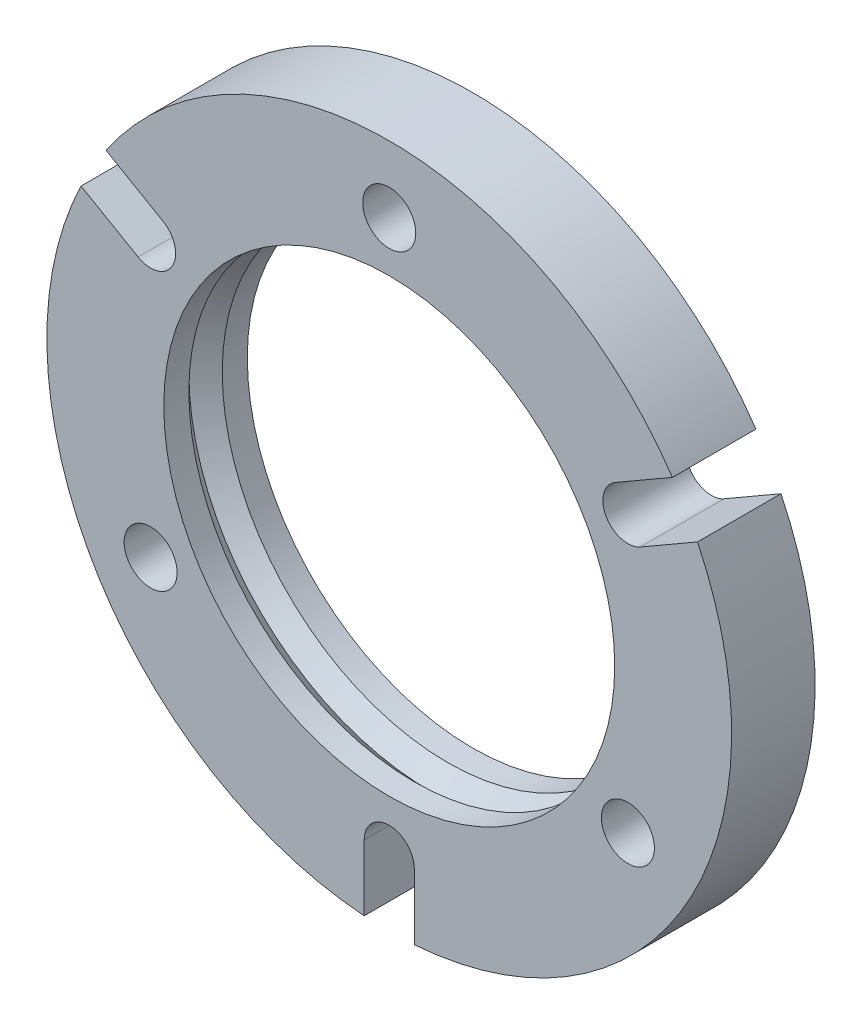
ISO-10303-21;
HEADER;
FILE_DESCRIPTION(('STEP AP214'),'2;1');
FILE_NAME('part.step','',(''),(''),'','','');
FILE_SCHEMA(('AUTOMOTIVE_DESIGN { 1 0 10303 214 1 1 1 1 }'));
ENDSEC;
DATA;
#1=APPLICATION_CONTEXT('core data for automotive mechanical design processes');
#2=APPLICATION_PROTOCOL_DEFINITION('international standard','automotive_design',2000,#1);
#3=PRODUCT_CONTEXT('',#1,'mechanical');
#4=PRODUCT('Part','Part','',(#3));
#5=PRODUCT_RELATED_PRODUCT_CATEGORY('part','',(#4));
#6=PRODUCT_DEFINITION_FORMATION('','',#4);
#7=PRODUCT_DEFINITION_CONTEXT('part definition',#1,'design');
#8=PRODUCT_DEFINITION('design','',#6,#7);
#9=PRODUCT_DEFINITION_SHAPE('','',#8);
#10=(LENGTH_UNIT() NAMED_UNIT(*) SI_UNIT(.MILLI.,.METRE.));
#11=(NAMED_UNIT(*) PLANE_ANGLE_UNIT() SI_UNIT($,.RADIAN.));
#12=(NAMED_UNIT(*) SI_UNIT($,.STERADIAN.) SOLID_ANGLE_UNIT());
#13=UNCERTAINTY_MEASURE_WITH_UNIT(LENGTH_MEASURE(1.E-05),#10,'distance_accuracy_value','');
#14=(GEOMETRIC_REPRESENTATION_CONTEXT(3) GLOBAL_UNCERTAINTY_ASSIGNED_CONTEXT((#13)) GLOBAL_UNIT_ASSIGNED_CONTEXT((#10,
#11,#12)) REPRESENTATION_CONTEXT('',''));
#15=CARTESIAN_POINT('',(0.,0.,0.));
#16=DIRECTION('',(0.,0.,1.));
#17=DIRECTION('',(1.,0.,0.));
#18=AXIS2_PLACEMENT_3D('',#15,#16,#17);
#19=CARTESIAN_POINT('',(0.,0.,5.));
#20=DIRECTION('',(0.,0.,1.));
#21=DIRECTION('',(1.,0.,0.));
#22=AXIS2_PLACEMENT_3D('',#19,#20,#21);
#23=PLANE('',#22);
#24=CARTESIAN_POINT('',(-14.2894191624432,-8.25,5.));
#25=DIRECTION('',(0.,0.,1.));
#26=DIRECTION('',(1.,0.,0.));
#27=AXIS2_PLACEMENT_3D('',#24,#25,#26);
#28=CIRCLE('',#27,1.5875);
#29=CARTESIAN_POINT('',(-12.7019191624432,-8.25,5.));
#30=VERTEX_POINT('',#29);
#31=EDGE_CURVE('E223',#30,#30,#28,.T.);
#32=ORIENTED_EDGE('',*,*,#31,.F.);
#33=EDGE_LOOP('',(#32));
#34=FACE_BOUND('',#33,.T.);
#35=CARTESIAN_POINT('',(0.,16.5,5.));
#36=DIRECTION('',(0.,0.,1.));
#37=DIRECTION('',(1.,0.,0.));
#38=AXIS2_PLACEMENT_3D('',#35,#36,#37);
#39=CIRCLE('',#38,1.5875);
#40=CARTESIAN_POINT('',(1.5875,16.5,5.));
#41=VERTEX_POINT('',#40);
#42=EDGE_CURVE('E235',#41,#41,#39,.T.);
#43=ORIENTED_EDGE('',*,*,#42,.F.);
#44=EDGE_LOOP('',(#43));
#45=FACE_BOUND('',#44,.T.);
#46=CARTESIAN_POINT('',(0.,0.,5.));
#47=DIRECTION('',(0.,0.,1.));
#48=DIRECTION('',(1.,0.,0.));
#49=AXIS2_PLACEMENT_3D('',#46,#47,#48);
#50=CIRCLE('',#49,13.5);
#51=CARTESIAN_POINT('',(13.5,0.,5.));
#52=VERTEX_POINT('',#51);
#53=EDGE_CURVE('E241',#52,#52,#50,.T.);
#54=ORIENTED_EDGE('',*,*,#53,.F.);
#55=EDGE_LOOP('',(#54));
#56=FACE_BOUND('',#55,.T.);
#57=CARTESIAN_POINT('',(14.2894191624432,-8.25,5.));
#58=DIRECTION('',(0.,0.,1.));
#59=DIRECTION('',(1.,0.,0.));
#60=AXIS2_PLACEMENT_3D('',#57,#58,#59);
#61=CIRCLE('',#60,1.5875);
#62=CARTESIAN_POINT('',(15.8769191624432,-8.25,5.));
#63=VERTEX_POINT('',#62);
#64=EDGE_CURVE('E229',#63,#63,#61,.T.);
#65=ORIENTED_EDGE('',*,*,#64,.F.);
#66=EDGE_LOOP('',(#65));
#67=FACE_BOUND('',#66,.T.);
#68=CARTESIAN_POINT('',(14.2894191624433,8.24999999999987,5.));
#69=DIRECTION('',(0.,0.,1.));
#70=DIRECTION('',(-0.499999999999992,0.866025403784443,0.));
#71=AXIS2_PLACEMENT_3D('',#68,#69,#70);
#72=CIRCLE('',#71,1.5);
#73=CARTESIAN_POINT('',(13.5394191624433,9.54903810567653,5.));
#74=VERTEX_POINT('',#73);
#75=CARTESIAN_POINT('',(15.0394191624433,6.9509618943232,5.));
#76=VERTEX_POINT('',#75);
#77=EDGE_CURVE('E152',#74,#76,#72,.T.);
#78=ORIENTED_EDGE('',*,*,#77,.F.);
#79=DIRECTION('',(0.866025403784443,0.499999999999992,0.));
#80=VECTOR('',#79,1.);
#81=CARTESIAN_POINT('',(38.4302201978176,23.919748783795,5.));
#82=LINE('',#81,#80);
#83=CARTESIAN_POINT('',(16.9559312096259,11.5215622558069,5.));
#84=VERTEX_POINT('',#83);
#85=EDGE_CURVE('E133',#74,#84,#82,.T.);
#86=ORIENTED_EDGE('',*,*,#85,.T.);
#87=CARTESIAN_POINT('',(0.,0.,5.));
#88=DIRECTION('',(0.,0.,1.));
#89=DIRECTION('',(1.,0.,0.));
#90=AXIS2_PLACEMENT_3D('',#87,#88,#89);
#91=CIRCLE('',#90,20.5);
#92=CARTESIAN_POINT('',(-16.9559312096257,11.5215622558072,5.));
#93=VERTEX_POINT('',#92);
#94=EDGE_CURVE('E45',#84,#93,#91,.T.);
#95=ORIENTED_EDGE('',*,*,#94,.T.);
#96=DIRECTION('',(-0.866025403784436,0.500000000000004,0.));
#97=VECTOR('',#96,1.);
#98=CARTESIAN_POINT('',(-38.4302201978172,23.9197487837955,5.));
#99=LINE('',#98,#97);
#100=CARTESIAN_POINT('',(-13.5394191624432,9.54903810567672,5.));
#101=VERTEX_POINT('',#100);
#102=EDGE_CURVE('E167',#101,#93,#99,.T.);
#103=ORIENTED_EDGE('',*,*,#102,.F.);
#104=CARTESIAN_POINT('',(-14.2894191624432,8.25000000000007,5.));
#105=DIRECTION('',(0.,0.,1.));
#106=DIRECTION('',(-0.500000000000004,-0.866025403784436,0.));
#107=AXIS2_PLACEMENT_3D('',#104,#105,#106);
#108=CIRCLE('',#107,1.5);
#109=CARTESIAN_POINT('',(-15.0394191624432,6.95096189432341,5.));
#110=VERTEX_POINT('',#109);
#111=EDGE_CURVE('E175',#110,#101,#108,.T.);
#112=ORIENTED_EDGE('',*,*,#111,.F.);
#113=DIRECTION('',(-0.866025403784436,0.500000000000004,0.));
#114=VECTOR('',#113,1.);
#115=CARTESIAN_POINT('',(-39.9302201978172,21.3216725724422,5.));
#116=LINE('',#115,#114);
#117=CARTESIAN_POINT('',(-18.4559312096257,8.92348604445386,5.));
#118=VERTEX_POINT('',#117);
#119=EDGE_CURVE('E160',#110,#118,#116,.T.);
#120=ORIENTED_EDGE('',*,*,#119,.T.);
#121=CARTESIAN_POINT('',(-1.5,-20.4450483002609,5.));
#122=VERTEX_POINT('',#121);
#123=EDGE_CURVE('E46',#118,#122,#91,.T.);
#124=ORIENTED_EDGE('',*,*,#123,.T.);
#125=DIRECTION('',(0.,-1.,0.));
#126=VECTOR('',#125,1.);
#127=CARTESIAN_POINT('',(-1.5,-45.2414213562373,5.));
#128=LINE('',#127,#126);
#129=CARTESIAN_POINT('',(-1.5,-16.5,5.));
#130=VERTEX_POINT('',#129);
#131=EDGE_CURVE('E200',#130,#122,#128,.T.);
#132=ORIENTED_EDGE('',*,*,#131,.F.);
#133=CARTESIAN_POINT('',(0.,-16.5,5.));
#134=DIRECTION('',(0.,0.,1.));
#135=DIRECTION('',(1.,0.,0.));
#136=AXIS2_PLACEMENT_3D('',#133,#134,#135);
#137=CIRCLE('',#136,1.5);
#138=CARTESIAN_POINT('',(1.5,-16.5,5.));
#139=VERTEX_POINT('',#138);
#140=EDGE_CURVE('E209',#139,#130,#137,.T.);
#141=ORIENTED_EDGE('',*,*,#140,.F.);
#142=DIRECTION('',(0.,-1.,0.));
#143=VECTOR('',#142,1.);
#144=CARTESIAN_POINT('',(1.5,-45.2414213562373,5.));
#145=LINE('',#144,#143);
#146=CARTESIAN_POINT('',(1.5,-20.4450483002609,5.));
#147=VERTEX_POINT('',#146);
#148=EDGE_CURVE('E196',#139,#147,#145,.T.);
#149=ORIENTED_EDGE('',*,*,#148,.T.);
#150=CARTESIAN_POINT('',(18.4559312096259,8.92348604445361,5.));
#151=VERTEX_POINT('',#150);
#152=EDGE_CURVE('E11',#147,#151,#91,.T.);
#153=ORIENTED_EDGE('',*,*,#152,.T.);
#154=DIRECTION('',(0.866025403784443,0.499999999999992,0.));
#155=VECTOR('',#154,1.);
#156=CARTESIAN_POINT('',(39.9302201978175,21.3216725724416,5.));
#157=LINE('',#156,#155);
#158=EDGE_CURVE('E53',#76,#151,#157,.T.);
#159=ORIENTED_EDGE('',*,*,#158,.F.);
#160=EDGE_LOOP('',(#78,#86,#95,#103,#112,#120,#124,#132,#141,#149,#153,#159));
#161=FACE_BOUND('',#160,.T.);
#162=ADVANCED_FACE('F36',(#34,#45,#56,#67,#161),#23,.T.);
#163=CARTESIAN_POINT('',(0.,0.,0.));
#164=DIRECTION('',(0.,0.,1.));
#165=DIRECTION('',(1.,0.,0.));
#166=AXIS2_PLACEMENT_3D('',#163,#164,#165);
#167=PLANE('',#166);
#168=CARTESIAN_POINT('',(-14.2894191624432,-8.25,0.));
#169=DIRECTION('',(0.,0.,1.));
#170=DIRECTION('',(1.,0.,0.));
#171=AXIS2_PLACEMENT_3D('',#168,#169,#170);
#172=CIRCLE('',#171,1.5875);
#173=CARTESIAN_POINT('',(-12.7019191624432,-8.25,0.));
#174=VERTEX_POINT('',#173);
#175=EDGE_CURVE('E216',#174,#174,#172,.T.);
#176=ORIENTED_EDGE('',*,*,#175,.T.);
#177=EDGE_LOOP('',(#176));
#178=FACE_BOUND('',#177,.T.);
#179=CARTESIAN_POINT('',(0.,16.5,0.));
#180=DIRECTION('',(0.,0.,1.));
#181=DIRECTION('',(1.,0.,0.));
#182=AXIS2_PLACEMENT_3D('',#179,#180,#181);
#183=CIRCLE('',#182,1.5875);
#184=CARTESIAN_POINT('',(1.5875,16.5,0.));
#185=VERTEX_POINT('',#184);
#186=EDGE_CURVE('E232',#185,#185,#183,.T.);
#187=ORIENTED_EDGE('',*,*,#186,.T.);
#188=EDGE_LOOP('',(#187));
#189=FACE_BOUND('',#188,.T.);
#190=CARTESIAN_POINT('',(0.,0.,0.));
#191=DIRECTION('',(0.,0.,1.));
#192=DIRECTION('',(1.,0.,0.));
#193=AXIS2_PLACEMENT_3D('',#190,#191,#192);
#194=CIRCLE('',#193,13.5);
#195=CARTESIAN_POINT('',(13.5,0.,0.));
#196=VERTEX_POINT('',#195);
#197=EDGE_CURVE('E238',#196,#196,#194,.T.);
#198=ORIENTED_EDGE('',*,*,#197,.T.);
#199=EDGE_LOOP('',(#198));
#200=FACE_BOUND('',#199,.T.);
#201=CARTESIAN_POINT('',(14.2894191624432,-8.25,0.));
#202=DIRECTION('',(0.,0.,1.));
#203=DIRECTION('',(1.,0.,0.));
#204=AXIS2_PLACEMENT_3D('',#201,#202,#203);
#205=CIRCLE('',#204,1.5875);
#206=CARTESIAN_POINT('',(15.8769191624432,-8.25,0.));
#207=VERTEX_POINT('',#206);
#208=EDGE_CURVE('E226',#207,#207,#205,.T.);
#209=ORIENTED_EDGE('',*,*,#208,.T.);
#210=EDGE_LOOP('',(#209));
#211=FACE_BOUND('',#210,.T.);
#212=DIRECTION('',(0.866025403784443,0.499999999999992,0.));
#213=VECTOR('',#212,1.);
#214=CARTESIAN_POINT('',(38.4302201978176,23.919748783795,0.));
#215=LINE('',#214,#213);
#216=CARTESIAN_POINT('',(13.5394191624433,9.54903810567653,0.));
#217=VERTEX_POINT('',#216);
#218=CARTESIAN_POINT('',(16.9559312096259,11.5215622558069,0.));
#219=VERTEX_POINT('',#218);
#220=EDGE_CURVE('E131',#217,#219,#215,.T.);
#221=ORIENTED_EDGE('',*,*,#220,.F.);
#222=CARTESIAN_POINT('',(14.2894191624433,8.24999999999987,0.));
#223=DIRECTION('',(0.,0.,1.));
#224=DIRECTION('',(-0.499999999999992,0.866025403784443,0.));
#225=AXIS2_PLACEMENT_3D('',#222,#223,#224);
#226=CIRCLE('',#225,1.5);
#227=CARTESIAN_POINT('',(15.0394191624433,6.9509618943232,0.));
#228=VERTEX_POINT('',#227);
#229=EDGE_CURVE('E141',#217,#228,#226,.T.);
#230=ORIENTED_EDGE('',*,*,#229,.T.);
#231=DIRECTION('',(0.866025403784443,0.499999999999992,0.));
#232=VECTOR('',#231,1.);
#233=CARTESIAN_POINT('',(39.9302201978175,21.3216725724416,0.));
#234=LINE('',#233,#232);
#235=CARTESIAN_POINT('',(18.4559312096259,8.92348604445361,0.));
#236=VERTEX_POINT('',#235);
#237=EDGE_CURVE('E138',#228,#236,#234,.T.);
#238=ORIENTED_EDGE('',*,*,#237,.T.);
#239=CARTESIAN_POINT('',(0.,0.,0.));
#240=DIRECTION('',(0.,0.,1.));
#241=DIRECTION('',(1.,0.,0.));
#242=AXIS2_PLACEMENT_3D('',#239,#240,#241);
#243=CIRCLE('',#242,20.5);
#244=CARTESIAN_POINT('',(1.5,-20.4450483002609,0.));
#245=VERTEX_POINT('',#244);
#246=EDGE_CURVE('E40',#245,#236,#243,.T.);
#247=ORIENTED_EDGE('',*,*,#246,.F.);
#248=DIRECTION('',(0.,-1.,0.));
#249=VECTOR('',#248,1.);
#250=CARTESIAN_POINT('',(1.5,-45.2414213562373,0.));
#251=LINE('',#250,#249);
#252=CARTESIAN_POINT('',(1.5,-16.5,0.));
#253=VERTEX_POINT('',#252);
#254=EDGE_CURVE('E197',#253,#245,#251,.T.);
#255=ORIENTED_EDGE('',*,*,#254,.F.);
#256=CARTESIAN_POINT('',(0.,-16.5,0.));
#257=DIRECTION('',(0.,0.,1.));
#258=DIRECTION('',(1.,0.,0.));
#259=AXIS2_PLACEMENT_3D('',#256,#257,#258);
#260=CIRCLE('',#259,1.5);
#261=CARTESIAN_POINT('',(-1.5,-16.5,0.));
#262=VERTEX_POINT('',#261);
#263=EDGE_CURVE('E199',#253,#262,#260,.T.);
#264=ORIENTED_EDGE('',*,*,#263,.T.);
#265=DIRECTION('',(0.,-1.,0.));
#266=VECTOR('',#265,1.);
#267=CARTESIAN_POINT('',(-1.5,-45.2414213562373,0.));
#268=LINE('',#267,#266);
#269=CARTESIAN_POINT('',(-1.5,-20.4450483002609,0.));
#270=VERTEX_POINT('',#269);
#271=EDGE_CURVE('E203',#262,#270,#268,.T.);
#272=ORIENTED_EDGE('',*,*,#271,.T.);
#273=CARTESIAN_POINT('',(-18.4559312096257,8.92348604445386,0.));
#274=VERTEX_POINT('',#273);
#275=EDGE_CURVE('E244',#274,#270,#243,.T.);
#276=ORIENTED_EDGE('',*,*,#275,.F.);
#277=DIRECTION('',(-0.866025403784436,0.500000000000004,0.));
#278=VECTOR('',#277,1.);
#279=CARTESIAN_POINT('',(-39.9302201978172,21.3216725724422,0.));
#280=LINE('',#279,#278);
#281=CARTESIAN_POINT('',(-15.0394191624432,6.95096189432341,0.));
#282=VERTEX_POINT('',#281);
#283=EDGE_CURVE('E164',#282,#274,#280,.T.);
#284=ORIENTED_EDGE('',*,*,#283,.F.);
#285=CARTESIAN_POINT('',(-14.2894191624432,8.25000000000007,0.));
#286=DIRECTION('',(0.,0.,1.));
#287=DIRECTION('',(-0.500000000000004,-0.866025403784436,0.));
#288=AXIS2_PLACEMENT_3D('',#285,#286,#287);
#289=CIRCLE('',#288,1.5);
#290=CARTESIAN_POINT('',(-13.5394191624432,9.54903810567672,0.));
#291=VERTEX_POINT('',#290);
#292=EDGE_CURVE('E166',#282,#291,#289,.T.);
#293=ORIENTED_EDGE('',*,*,#292,.T.);
#294=DIRECTION('',(-0.866025403784436,0.500000000000004,0.));
#295=VECTOR('',#294,1.);
#296=CARTESIAN_POINT('',(-38.4302201978172,23.9197487837955,0.));
#297=LINE('',#296,#295);
#298=CARTESIAN_POINT('',(-16.9559312096257,11.5215622558072,0.));
#299=VERTEX_POINT('',#298);
#300=EDGE_CURVE('E170',#291,#299,#297,.T.);
#301=ORIENTED_EDGE('',*,*,#300,.T.);
#302=EDGE_CURVE('E150',#219,#299,#243,.T.);
#303=ORIENTED_EDGE('',*,*,#302,.F.);
#304=EDGE_LOOP('',(#221,#230,#238,#247,#255,#264,#272,#276,#284,#293,#301,#303));
#305=FACE_BOUND('',#304,.T.);
#306=ADVANCED_FACE('F148',(#178,#189,#200,#211,#305),#167,.F.);
#307=CARTESIAN_POINT('',(0.,0.,5.));
#308=DIRECTION('',(0.,0.,-1.));
#309=DIRECTION('',(-1.,0.,0.));
#310=AXIS2_PLACEMENT_3D('',#307,#308,#309);
#311=CYLINDRICAL_SURFACE('',#310,20.5);
#312=DIRECTION('',(0.,0.,1.));
#313=VECTOR('',#312,1.);
#314=CARTESIAN_POINT('',(16.9559312096259,11.5215622558069,0.));
#315=LINE('',#314,#313);
#316=EDGE_CURVE('E158',#219,#84,#315,.T.);
#317=ORIENTED_EDGE('',*,*,#316,.F.);
#318=ORIENTED_EDGE('',*,*,#302,.T.);
#319=DIRECTION('',(0.,0.,1.));
#320=VECTOR('',#319,1.);
#321=CARTESIAN_POINT('',(-16.9559312096257,11.5215622558072,0.));
#322=LINE('',#321,#320);
#323=EDGE_CURVE('E182',#299,#93,#322,.T.);
#324=ORIENTED_EDGE('',*,*,#323,.T.);
#325=ORIENTED_EDGE('',*,*,#94,.F.);
#326=EDGE_LOOP('',(#317,#318,#324,#325));
#327=FACE_BOUND('',#326,.T.);
#328=ADVANCED_FACE('F283',(#327),#311,.T.);
#329=DIRECTION('',(0.,0.,1.));
#330=VECTOR('',#329,1.);
#331=CARTESIAN_POINT('',(-18.4559312096257,8.92348604445386,0.));
#332=LINE('',#331,#330);
#333=EDGE_CURVE('E179',#274,#118,#332,.T.);
#334=ORIENTED_EDGE('',*,*,#333,.F.);
#335=ORIENTED_EDGE('',*,*,#275,.T.);
#336=DIRECTION('',(0.,0.,1.));
#337=VECTOR('',#336,1.);
#338=CARTESIAN_POINT('',(-1.5,-20.4450483002609,0.));
#339=LINE('',#338,#337);
#340=EDGE_CURVE('E217',#270,#122,#339,.T.);
#341=ORIENTED_EDGE('',*,*,#340,.T.);
#342=ORIENTED_EDGE('',*,*,#123,.F.);
#343=EDGE_LOOP('',(#334,#335,#341,#342));
#344=FACE_BOUND('',#343,.T.);
#345=ADVANCED_FACE('F253',(#344),#311,.T.);
#346=CARTESIAN_POINT('',(0.,0.,5.));
#347=DIRECTION('',(0.,0.,-1.));
#348=DIRECTION('',(-1.,0.,0.));
#349=AXIS2_PLACEMENT_3D('',#346,#347,#348);
#350=CYLINDRICAL_SURFACE('',#349,13.5);
#351=ORIENTED_EDGE('',*,*,#197,.F.);
#352=EDGE_LOOP('',(#351));
#353=FACE_BOUND('',#352,.T.);
#354=CARTESIAN_POINT('',(0.,0.,1.50000000000002));
#355=DIRECTION('',(0.,0.,-1.));
#356=DIRECTION('',(-1.,0.,0.));
#357=AXIS2_PLACEMENT_3D('',#354,#355,#356);
#358=CIRCLE('',#357,13.5);
#359=CARTESIAN_POINT('',(-13.5,0.,1.50000000000002));
#360=VERTEX_POINT('',#359);
#361=EDGE_CURVE('E181',#360,#360,#358,.T.);
#362=ORIENTED_EDGE('',*,*,#361,.F.);
#363=EDGE_LOOP('',(#362));
#364=FACE_BOUND('',#363,.T.);
#365=ADVANCED_FACE('F250',(#353,#364),#350,.F.);
#366=ORIENTED_EDGE('',*,*,#246,.T.);
#367=DIRECTION('',(0.,0.,1.));
#368=VECTOR('',#367,1.);
#369=CARTESIAN_POINT('',(18.4559312096259,8.92348604445361,0.));
#370=LINE('',#369,#368);
#371=EDGE_CURVE('E161',#236,#151,#370,.T.);
#372=ORIENTED_EDGE('',*,*,#371,.T.);
#373=ORIENTED_EDGE('',*,*,#152,.F.);
#374=DIRECTION('',(0.,0.,1.));
#375=VECTOR('',#374,1.);
#376=CARTESIAN_POINT('',(1.5,-20.4450483002609,0.));
#377=LINE('',#376,#375);
#378=EDGE_CURVE('E214',#245,#147,#377,.T.);
#379=ORIENTED_EDGE('',*,*,#378,.F.);
#380=EDGE_LOOP('',(#366,#372,#373,#379));
#381=FACE_BOUND('',#380,.T.);
#382=ADVANCED_FACE('F38',(#381),#311,.T.);
#383=CARTESIAN_POINT('',(0.,0.,3.49999999999999));
#384=DIRECTION('',(0.,0.,-1.));
#385=DIRECTION('',(-1.,0.,0.));
#386=AXIS2_PLACEMENT_3D('',#383,#384,#385);
#387=CIRCLE('',#386,13.5);
#388=CARTESIAN_POINT('',(-13.5,0.,3.49999999999999));
#389=VERTEX_POINT('',#388);
#390=EDGE_CURVE('E190',#389,#389,#387,.T.);
#391=ORIENTED_EDGE('',*,*,#390,.T.);
#392=EDGE_LOOP('',(#391));
#393=FACE_BOUND('',#392,.T.);
#394=ORIENTED_EDGE('',*,*,#53,.T.);
#395=EDGE_LOOP('',(#394));
#396=FACE_BOUND('',#395,.T.);
#397=ADVANCED_FACE('F255',(#393,#396),#350,.F.);
#398=CARTESIAN_POINT('',(0.,16.5,5.));
#399=DIRECTION('',(0.,0.,-1.));
#400=DIRECTION('',(-1.,0.,0.));
#401=AXIS2_PLACEMENT_3D('',#398,#399,#400);
#402=CYLINDRICAL_SURFACE('',#401,1.5875);
#403=ORIENTED_EDGE('',*,*,#42,.T.);
#404=EDGE_LOOP('',(#403));
#405=FACE_BOUND('',#404,.T.);
#406=ORIENTED_EDGE('',*,*,#186,.F.);
#407=EDGE_LOOP('',(#406));
#408=FACE_BOUND('',#407,.T.);
#409=ADVANCED_FACE('F289',(#405,#408),#402,.F.);
#410=CARTESIAN_POINT('',(14.2894191624432,-8.25,5.));
#411=DIRECTION('',(0.,0.,-1.));
#412=DIRECTION('',(-1.,0.,0.));
#413=AXIS2_PLACEMENT_3D('',#410,#411,#412);
#414=CYLINDRICAL_SURFACE('',#413,1.5875);
#415=ORIENTED_EDGE('',*,*,#64,.T.);
#416=EDGE_LOOP('',(#415));
#417=FACE_BOUND('',#416,.T.);
#418=ORIENTED_EDGE('',*,*,#208,.F.);
#419=EDGE_LOOP('',(#418));
#420=FACE_BOUND('',#419,.T.);
#421=ADVANCED_FACE('F293',(#417,#420),#414,.F.);
#422=CARTESIAN_POINT('',(-14.2894191624432,-8.25,5.));
#423=DIRECTION('',(0.,0.,-1.));
#424=DIRECTION('',(-1.,0.,0.));
#425=AXIS2_PLACEMENT_3D('',#422,#423,#424);
#426=CYLINDRICAL_SURFACE('',#425,1.5875);
#427=ORIENTED_EDGE('',*,*,#31,.T.);
#428=EDGE_LOOP('',(#427));
#429=FACE_BOUND('',#428,.T.);
#430=ORIENTED_EDGE('',*,*,#175,.F.);
#431=EDGE_LOOP('',(#430));
#432=FACE_BOUND('',#431,.T.);
#433=ADVANCED_FACE('F297',(#429,#432),#426,.F.);
#434=CARTESIAN_POINT('',(1.5,-45.2414213562373,0.));
#435=DIRECTION('',(-1.,0.,0.));
#436=DIRECTION('',(0.,0.,1.));
#437=AXIS2_PLACEMENT_3D('',#434,#435,#436);
#438=PLANE('',#437);
#439=ORIENTED_EDGE('',*,*,#148,.F.);
#440=DIRECTION('',(0.,0.,1.));
#441=VECTOR('',#440,1.);
#442=CARTESIAN_POINT('',(1.5,-16.5,0.));
#443=LINE('',#442,#441);
#444=EDGE_CURVE('E206',#253,#139,#443,.T.);
#445=ORIENTED_EDGE('',*,*,#444,.F.);
#446=ORIENTED_EDGE('',*,*,#254,.T.);
#447=ORIENTED_EDGE('',*,*,#378,.T.);
#448=EDGE_LOOP('',(#439,#445,#446,#447));
#449=FACE_BOUND('',#448,.T.);
#450=ADVANCED_FACE('F301',(#449),#438,.T.);
#451=CARTESIAN_POINT('',(-1.5,-45.2414213562373,0.));
#452=DIRECTION('',(-1.,0.,0.));
#453=DIRECTION('',(0.,0.,1.));
#454=AXIS2_PLACEMENT_3D('',#451,#452,#453);
#455=PLANE('',#454);
#456=ORIENTED_EDGE('',*,*,#131,.T.);
#457=ORIENTED_EDGE('',*,*,#340,.F.);
#458=ORIENTED_EDGE('',*,*,#271,.F.);
#459=DIRECTION('',(0.,0.,1.));
#460=VECTOR('',#459,1.);
#461=CARTESIAN_POINT('',(-1.5,-16.5,0.));
#462=LINE('',#461,#460);
#463=EDGE_CURVE('E220',#262,#130,#462,.T.);
#464=ORIENTED_EDGE('',*,*,#463,.T.);
#465=EDGE_LOOP('',(#456,#457,#458,#464));
#466=FACE_BOUND('',#465,.T.);
#467=ADVANCED_FACE('F305',(#466),#455,.F.);
#468=CARTESIAN_POINT('',(0.,-16.5,0.));
#469=DIRECTION('',(0.,0.,1.));
#470=DIRECTION('',(1.,0.,0.));
#471=AXIS2_PLACEMENT_3D('',#468,#469,#470);
#472=CYLINDRICAL_SURFACE('',#471,1.5);
#473=ORIENTED_EDGE('',*,*,#140,.T.);
#474=ORIENTED_EDGE('',*,*,#463,.F.);
#475=ORIENTED_EDGE('',*,*,#263,.F.);
#476=ORIENTED_EDGE('',*,*,#444,.T.);
#477=EDGE_LOOP('',(#473,#474,#475,#476));
#478=FACE_BOUND('',#477,.T.);
#479=ADVANCED_FACE('F262',(#478),#472,.F.);
#480=CARTESIAN_POINT('',(0.,0.,2.5));
#481=DIRECTION('',(0.,0.,1.));
#482=DIRECTION('',(1.,0.,0.));
#483=AXIS2_PLACEMENT_3D('',#480,#481,#482);
#484=CONICAL_SURFACE('',#483,14.5,0.785398163397456);
#485=ORIENTED_EDGE('',*,*,#361,.T.);
#486=EDGE_LOOP('',(#485));
#487=FACE_BOUND('',#486,.T.);
#488=CARTESIAN_POINT('',(0.,0.,2.5));
#489=DIRECTION('',(0.,0.,-1.));
#490=DIRECTION('',(-1.,0.,0.));
#491=AXIS2_PLACEMENT_3D('',#488,#489,#490);
#492=CIRCLE('',#491,14.5);
#493=CARTESIAN_POINT('',(-14.5,0.,2.5));
#494=VERTEX_POINT('',#493);
#495=EDGE_CURVE('E193',#494,#494,#492,.T.);
#496=ORIENTED_EDGE('',*,*,#495,.F.);
#497=EDGE_LOOP('',(#496));
#498=FACE_BOUND('',#497,.T.);
#499=ADVANCED_FACE('F258',(#487,#498),#484,.F.);
#500=CARTESIAN_POINT('',(0.,0.,2.5));
#501=DIRECTION('',(0.,0.,-1.));
#502=DIRECTION('',(-1.,0.,0.));
#503=AXIS2_PLACEMENT_3D('',#500,#501,#502);
#504=CONICAL_SURFACE('',#503,14.5,0.785398163397454);
#505=ORIENTED_EDGE('',*,*,#390,.F.);
#506=EDGE_LOOP('',(#505));
#507=FACE_BOUND('',#506,.T.);
#508=ORIENTED_EDGE('',*,*,#495,.T.);
#509=EDGE_LOOP('',(#508));
#510=FACE_BOUND('',#509,.T.);
#511=ADVANCED_FACE('F261',(#507,#510),#504,.F.);
#512=CARTESIAN_POINT('',(-39.9302201978172,21.3216725724422,0.));
#513=DIRECTION('',(0.500000000000004,0.866025403784436,0.));
#514=DIRECTION('',(-0.866025403784436,0.500000000000004,0.));
#515=AXIS2_PLACEMENT_3D('',#512,#513,#514);
#516=PLANE('',#515);
#517=ORIENTED_EDGE('',*,*,#119,.F.);
#518=DIRECTION('',(0.,0.,1.));
#519=VECTOR('',#518,1.);
#520=CARTESIAN_POINT('',(-15.0394191624432,6.95096189432341,0.));
#521=LINE('',#520,#519);
#522=EDGE_CURVE('E172',#282,#110,#521,.T.);
#523=ORIENTED_EDGE('',*,*,#522,.F.);
#524=ORIENTED_EDGE('',*,*,#283,.T.);
#525=ORIENTED_EDGE('',*,*,#333,.T.);
#526=EDGE_LOOP('',(#517,#523,#524,#525));
#527=FACE_BOUND('',#526,.T.);
#528=ADVANCED_FACE('F267',(#527),#516,.T.);
#529=CARTESIAN_POINT('',(-38.4302201978172,23.9197487837955,0.));
#530=DIRECTION('',(0.500000000000004,0.866025403784436,0.));
#531=DIRECTION('',(-0.866025403784436,0.500000000000004,0.));
#532=AXIS2_PLACEMENT_3D('',#529,#530,#531);
#533=PLANE('',#532);
#534=ORIENTED_EDGE('',*,*,#102,.T.);
#535=ORIENTED_EDGE('',*,*,#323,.F.);
#536=ORIENTED_EDGE('',*,*,#300,.F.);
#537=DIRECTION('',(0.,0.,1.));
#538=VECTOR('',#537,1.);
#539=CARTESIAN_POINT('',(-13.5394191624432,9.54903810567672,0.));
#540=LINE('',#539,#538);
#541=EDGE_CURVE('E185',#291,#101,#540,.T.);
#542=ORIENTED_EDGE('',*,*,#541,.T.);
#543=EDGE_LOOP('',(#534,#535,#536,#542));
#544=FACE_BOUND('',#543,.T.);
#545=ADVANCED_FACE('F273',(#544),#533,.F.);
#546=CARTESIAN_POINT('',(-14.2894191624432,8.25000000000007,0.));
#547=DIRECTION('',(0.,0.,1.));
#548=DIRECTION('',(1.,0.,0.));
#549=AXIS2_PLACEMENT_3D('',#546,#547,#548);
#550=CYLINDRICAL_SURFACE('',#549,1.5);
#551=ORIENTED_EDGE('',*,*,#111,.T.);
#552=ORIENTED_EDGE('',*,*,#541,.F.);
#553=ORIENTED_EDGE('',*,*,#292,.F.);
#554=ORIENTED_EDGE('',*,*,#522,.T.);
#555=EDGE_LOOP('',(#551,#552,#553,#554));
#556=FACE_BOUND('',#555,.T.);
#557=ADVANCED_FACE('F332',(#556),#550,.F.);
#558=CARTESIAN_POINT('',(38.4302201978176,23.919748783795,0.));
#559=DIRECTION('',(0.499999999999992,-0.866025403784443,0.));
#560=DIRECTION('',(0.866025403784443,0.499999999999992,0.));
#561=AXIS2_PLACEMENT_3D('',#558,#559,#560);
#562=PLANE('',#561);
#563=ORIENTED_EDGE('',*,*,#85,.F.);
#564=DIRECTION('',(0.,0.,1.));
#565=VECTOR('',#564,1.);
#566=CARTESIAN_POINT('',(13.5394191624433,9.54903810567653,0.));
#567=LINE('',#566,#565);
#568=EDGE_CURVE('E127',#217,#74,#567,.T.);
#569=ORIENTED_EDGE('',*,*,#568,.F.);
#570=ORIENTED_EDGE('',*,*,#220,.T.);
#571=ORIENTED_EDGE('',*,*,#316,.T.);
#572=EDGE_LOOP('',(#563,#569,#570,#571));
#573=FACE_BOUND('',#572,.T.);
#574=ADVANCED_FACE('F129',(#573),#562,.T.);
#575=CARTESIAN_POINT('',(39.9302201978175,21.3216725724416,0.));
#576=DIRECTION('',(0.499999999999992,-0.866025403784443,0.));
#577=DIRECTION('',(0.866025403784443,0.499999999999992,0.));
#578=AXIS2_PLACEMENT_3D('',#575,#576,#577);
#579=PLANE('',#578);
#580=ORIENTED_EDGE('',*,*,#158,.T.);
#581=ORIENTED_EDGE('',*,*,#371,.F.);
#582=ORIENTED_EDGE('',*,*,#237,.F.);
#583=DIRECTION('',(0.,0.,1.));
#584=VECTOR('',#583,1.);
#585=CARTESIAN_POINT('',(15.0394191624433,6.9509618943232,0.));
#586=LINE('',#585,#584);
#587=EDGE_CURVE('E137',#228,#76,#586,.T.);
#588=ORIENTED_EDGE('',*,*,#587,.T.);
#589=EDGE_LOOP('',(#580,#581,#582,#588));
#590=FACE_BOUND('',#589,.T.);
#591=ADVANCED_FACE('F338',(#590),#579,.F.);
#592=CARTESIAN_POINT('',(14.2894191624433,8.24999999999987,0.));
#593=DIRECTION('',(0.,0.,1.));
#594=DIRECTION('',(1.,0.,0.));
#595=AXIS2_PLACEMENT_3D('',#592,#593,#594);
#596=CYLINDRICAL_SURFACE('',#595,1.5);
#597=ORIENTED_EDGE('',*,*,#77,.T.);
#598=ORIENTED_EDGE('',*,*,#587,.F.);
#599=ORIENTED_EDGE('',*,*,#229,.F.);
#600=ORIENTED_EDGE('',*,*,#568,.T.);
#601=EDGE_LOOP('',(#597,#598,#599,#600));
#602=FACE_BOUND('',#601,.T.);
#603=ADVANCED_FACE('F142',(#602),#596,.F.);
#604=CLOSED_SHELL('',(#162,#306,#328,#345,#365,#382,#397,#409,#421,#433,#450,#467,#479,#499,
#511,#528,#545,#557,#574,#591,#603));
#605=MANIFOLD_SOLID_BREP('B2',#604);
#606=ADVANCED_BREP_SHAPE_REPRESENTATION('',(#18,#605),#14);
#607=SHAPE_DEFINITION_REPRESENTATION(#9,#606);
ENDSEC;
END-ISO-10303-21;
